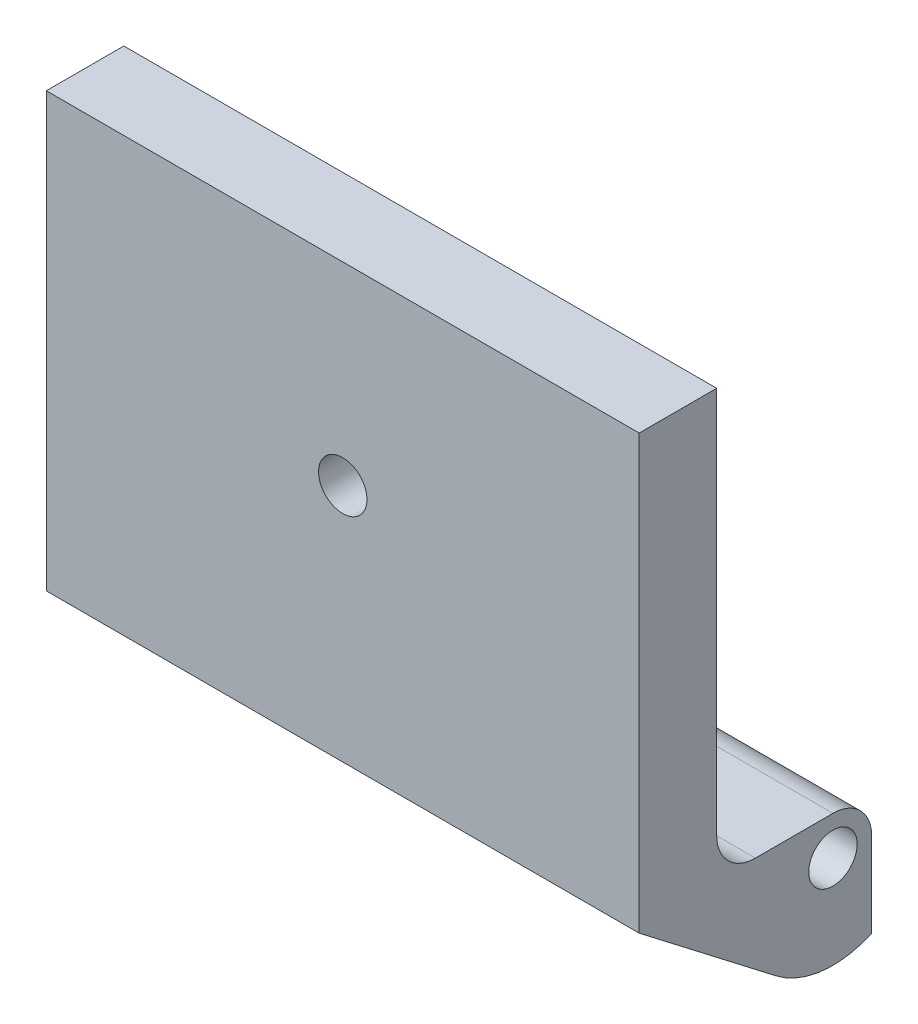
ISO-10303-21;
HEADER;
FILE_DESCRIPTION(('STEP AP214'),'2;1');
FILE_NAME('part.step','',(''),(''),'','','');
FILE_SCHEMA(('AUTOMOTIVE_DESIGN { 1 0 10303 214 1 1 1 1 }'));
ENDSEC;
DATA;
#1=APPLICATION_CONTEXT('core data for automotive mechanical design processes');
#2=APPLICATION_PROTOCOL_DEFINITION('international standard','automotive_design',2000,#1);
#3=PRODUCT_CONTEXT('',#1,'mechanical');
#4=PRODUCT('Part','Part','',(#3));
#5=PRODUCT_RELATED_PRODUCT_CATEGORY('part','',(#4));
#6=PRODUCT_DEFINITION_FORMATION('','',#4);
#7=PRODUCT_DEFINITION_CONTEXT('part definition',#1,'design');
#8=PRODUCT_DEFINITION('design','',#6,#7);
#9=PRODUCT_DEFINITION_SHAPE('','',#8);
#10=(LENGTH_UNIT() NAMED_UNIT(*) SI_UNIT(.MILLI.,.METRE.));
#11=(NAMED_UNIT(*) PLANE_ANGLE_UNIT() SI_UNIT($,.RADIAN.));
#12=(NAMED_UNIT(*) SI_UNIT($,.STERADIAN.) SOLID_ANGLE_UNIT());
#13=UNCERTAINTY_MEASURE_WITH_UNIT(LENGTH_MEASURE(1.E-05),#10,'distance_accuracy_value','');
#14=(GEOMETRIC_REPRESENTATION_CONTEXT(3) GLOBAL_UNCERTAINTY_ASSIGNED_CONTEXT((#13)) GLOBAL_UNIT_ASSIGNED_CONTEXT((#10,
#11,#12)) REPRESENTATION_CONTEXT('',''));
#15=CARTESIAN_POINT('',(0.,0.,0.));
#16=DIRECTION('',(0.,0.,1.));
#17=DIRECTION('',(1.,0.,0.));
#18=AXIS2_PLACEMENT_3D('',#15,#16,#17);
#19=CARTESIAN_POINT('',(-19.431,17.78,12.7));
#20=DIRECTION('',(1.,0.,0.));
#21=DIRECTION('',(0.,0.,-1.));
#22=AXIS2_PLACEMENT_3D('',#19,#20,#21);
#23=PLANE('',#22);
#24=CARTESIAN_POINT('',(-19.431,6.35,0.));
#25=DIRECTION('',(1.,0.,0.));
#26=DIRECTION('',(0.,0.,-1.));
#27=AXIS2_PLACEMENT_3D('',#24,#25,#26);
#28=CIRCLE('',#27,1.5875);
#29=CARTESIAN_POINT('',(-19.431,6.35,-1.5875));
#30=VERTEX_POINT('',#29);
#31=EDGE_CURVE('E160',#30,#30,#28,.T.);
#32=ORIENTED_EDGE('',*,*,#31,.T.);
#33=EDGE_LOOP('',(#32));
#34=FACE_BOUND('',#33,.T.);
#35=CARTESIAN_POINT('',(-19.431,6.35,0.));
#36=DIRECTION('',(-1.,0.,0.));
#37=DIRECTION('',(0.,0.,-1.));
#38=AXIS2_PLACEMENT_3D('',#35,#36,#37);
#39=CIRCLE('',#38,6.096);
#40=CARTESIAN_POINT('',(-19.431,0.808374245765057,-2.54));
#41=VERTEX_POINT('',#40);
#42=CARTESIAN_POINT('',(-19.431,1.5203526713738,3.71964012790133));
#43=VERTEX_POINT('',#42);
#44=EDGE_CURVE('E114',#41,#43,#39,.T.);
#45=ORIENTED_EDGE('',*,*,#44,.T.);
#46=DIRECTION('',(0.,0.61017718633552,0.792264981730019));
#47=VECTOR('',#46,1.);
#48=CARTESIAN_POINT('',(-19.431,8.43673903881376,12.7));
#49=LINE('',#48,#47);
#50=CARTESIAN_POINT('',(-19.431,8.43673903881376,12.7));
#51=VERTEX_POINT('',#50);
#52=EDGE_CURVE('E125',#43,#51,#49,.T.);
#53=ORIENTED_EDGE('',*,*,#52,.T.);
#54=DIRECTION('',(0.,-1.,0.));
#55=VECTOR('',#54,1.);
#56=CARTESIAN_POINT('',(-19.431,17.78,12.7));
#57=LINE('',#56,#55);
#58=CARTESIAN_POINT('',(-19.431,36.83,12.7));
#59=VERTEX_POINT('',#58);
#60=EDGE_CURVE('E11',#59,#51,#57,.T.);
#61=ORIENTED_EDGE('',*,*,#60,.F.);
#62=DIRECTION('',(0.,0.,-1.));
#63=VECTOR('',#62,1.);
#64=CARTESIAN_POINT('',(-19.431,36.83,59.1264476780208));
#65=LINE('',#64,#63);
#66=CARTESIAN_POINT('',(-19.431,36.83,7.62));
#67=VERTEX_POINT('',#66);
#68=EDGE_CURVE('E181',#59,#67,#65,.T.);
#69=ORIENTED_EDGE('',*,*,#68,.T.);
#70=DIRECTION('',(0.,-1.,0.));
#71=VECTOR('',#70,1.);
#72=CARTESIAN_POINT('',(-19.431,17.78,7.62));
#73=LINE('',#72,#71);
#74=CARTESIAN_POINT('',(-19.431,11.43,7.62));
#75=VERTEX_POINT('',#74);
#76=EDGE_CURVE('E154',#67,#75,#73,.T.);
#77=ORIENTED_EDGE('',*,*,#76,.T.);
#78=CARTESIAN_POINT('',(-19.431,11.43,5.08));
#79=DIRECTION('',(1.,0.,0.));
#80=DIRECTION('',(0.,0.,1.));
#81=AXIS2_PLACEMENT_3D('',#78,#79,#80);
#82=CIRCLE('',#81,2.54);
#83=CARTESIAN_POINT('',(-19.431,8.89,5.08));
#84=VERTEX_POINT('',#83);
#85=EDGE_CURVE('E193',#75,#84,#82,.T.);
#86=ORIENTED_EDGE('',*,*,#85,.T.);
#87=DIRECTION('',(0.,0.,-1.));
#88=VECTOR('',#87,1.);
#89=CARTESIAN_POINT('',(-19.431,8.89,5.08));
#90=LINE('',#89,#88);
#91=CARTESIAN_POINT('',(-19.431,8.89,0.));
#92=VERTEX_POINT('',#91);
#93=EDGE_CURVE('E138',#84,#92,#90,.T.);
#94=ORIENTED_EDGE('',*,*,#93,.T.);
#95=CARTESIAN_POINT('',(-19.431,6.35,0.));
#96=DIRECTION('',(-1.,0.,0.));
#97=DIRECTION('',(0.,0.,-1.));
#98=AXIS2_PLACEMENT_3D('',#95,#96,#97);
#99=CIRCLE('',#98,2.54);
#100=CARTESIAN_POINT('',(-19.431,6.34999999999998,-2.54));
#101=VERTEX_POINT('',#100);
#102=EDGE_CURVE('E134',#92,#101,#99,.T.);
#103=ORIENTED_EDGE('',*,*,#102,.T.);
#104=DIRECTION('',(0.,-1.,0.));
#105=VECTOR('',#104,1.);
#106=CARTESIAN_POINT('',(-19.431,6.34999999999998,-2.54));
#107=LINE('',#106,#105);
#108=EDGE_CURVE('E128',#101,#41,#107,.T.);
#109=ORIENTED_EDGE('',*,*,#108,.T.);
#110=EDGE_LOOP('',(#45,#53,#61,#69,#77,#86,#94,#103,#109));
#111=FACE_BOUND('',#110,.T.);
#112=ADVANCED_FACE('F38',(#34,#111),#23,.F.);
#113=CARTESIAN_POINT('',(19.431,17.78,12.7));
#114=DIRECTION('',(-1.,0.,0.));
#115=DIRECTION('',(0.,0.,1.));
#116=AXIS2_PLACEMENT_3D('',#113,#114,#115);
#117=PLANE('',#116);
#118=CARTESIAN_POINT('',(19.431,6.35,0.));
#119=DIRECTION('',(1.,0.,0.));
#120=DIRECTION('',(0.,0.,-1.));
#121=AXIS2_PLACEMENT_3D('',#118,#119,#120);
#122=CIRCLE('',#121,1.5875);
#123=CARTESIAN_POINT('',(19.431,6.35,-1.5875));
#124=VERTEX_POINT('',#123);
#125=EDGE_CURVE('E156',#124,#124,#122,.T.);
#126=ORIENTED_EDGE('',*,*,#125,.F.);
#127=EDGE_LOOP('',(#126));
#128=FACE_BOUND('',#127,.T.);
#129=DIRECTION('',(0.,-1.,0.));
#130=VECTOR('',#129,1.);
#131=CARTESIAN_POINT('',(19.431,17.78,12.7));
#132=LINE('',#131,#130);
#133=CARTESIAN_POINT('',(19.431,36.83,12.7));
#134=VERTEX_POINT('',#133);
#135=CARTESIAN_POINT('',(19.431,8.43673903881377,12.7));
#136=VERTEX_POINT('',#135);
#137=EDGE_CURVE('E45',#134,#136,#132,.T.);
#138=ORIENTED_EDGE('',*,*,#137,.T.);
#139=DIRECTION('',(0.,0.61017718633552,0.792264981730019));
#140=VECTOR('',#139,1.);
#141=CARTESIAN_POINT('',(19.431,8.43673903881376,12.7));
#142=LINE('',#141,#140);
#143=CARTESIAN_POINT('',(19.431,1.5203526713738,3.71964012790133));
#144=VERTEX_POINT('',#143);
#145=EDGE_CURVE('E52',#144,#136,#142,.T.);
#146=ORIENTED_EDGE('',*,*,#145,.F.);
#147=CARTESIAN_POINT('',(19.431,6.35,0.));
#148=DIRECTION('',(-1.,0.,0.));
#149=DIRECTION('',(0.,0.,-1.));
#150=AXIS2_PLACEMENT_3D('',#147,#148,#149);
#151=CIRCLE('',#150,6.096);
#152=CARTESIAN_POINT('',(19.431,0.808374245765057,-2.54));
#153=VERTEX_POINT('',#152);
#154=EDGE_CURVE('E244',#153,#144,#151,.T.);
#155=ORIENTED_EDGE('',*,*,#154,.F.);
#156=DIRECTION('',(0.,-1.,0.));
#157=VECTOR('',#156,1.);
#158=CARTESIAN_POINT('',(19.431,6.34999999999998,-2.54));
#159=LINE('',#158,#157);
#160=CARTESIAN_POINT('',(19.431,6.34999999999998,-2.54));
#161=VERTEX_POINT('',#160);
#162=EDGE_CURVE('E131',#161,#153,#159,.T.);
#163=ORIENTED_EDGE('',*,*,#162,.F.);
#164=CARTESIAN_POINT('',(19.431,6.35,0.));
#165=DIRECTION('',(-1.,0.,0.));
#166=DIRECTION('',(0.,0.,-1.));
#167=AXIS2_PLACEMENT_3D('',#164,#165,#166);
#168=CIRCLE('',#167,2.54);
#169=CARTESIAN_POINT('',(19.431,8.89,0.));
#170=VERTEX_POINT('',#169);
#171=EDGE_CURVE('E151',#170,#161,#168,.T.);
#172=ORIENTED_EDGE('',*,*,#171,.F.);
#173=DIRECTION('',(0.,0.,-1.));
#174=VECTOR('',#173,1.);
#175=CARTESIAN_POINT('',(19.431,8.89,5.08));
#176=LINE('',#175,#174);
#177=CARTESIAN_POINT('',(19.431,8.89,5.08));
#178=VERTEX_POINT('',#177);
#179=EDGE_CURVE('E148',#178,#170,#176,.T.);
#180=ORIENTED_EDGE('',*,*,#179,.F.);
#181=CARTESIAN_POINT('',(19.431,11.43,5.08));
#182=DIRECTION('',(1.,0.,0.));
#183=DIRECTION('',(0.,0.,1.));
#184=AXIS2_PLACEMENT_3D('',#181,#182,#183);
#185=CIRCLE('',#184,2.54);
#186=CARTESIAN_POINT('',(19.431,11.43,7.62));
#187=VERTEX_POINT('',#186);
#188=EDGE_CURVE('E144',#187,#178,#185,.T.);
#189=ORIENTED_EDGE('',*,*,#188,.F.);
#190=DIRECTION('',(0.,-1.,0.));
#191=VECTOR('',#190,1.);
#192=CARTESIAN_POINT('',(19.431,17.78,7.62));
#193=LINE('',#192,#191);
#194=CARTESIAN_POINT('',(19.431,36.83,7.62));
#195=VERTEX_POINT('',#194);
#196=EDGE_CURVE('E142',#195,#187,#193,.T.);
#197=ORIENTED_EDGE('',*,*,#196,.F.);
#198=DIRECTION('',(0.,0.,-1.));
#199=VECTOR('',#198,1.);
#200=CARTESIAN_POINT('',(19.431,36.83,59.1264476780208));
#201=LINE('',#200,#199);
#202=EDGE_CURVE('E169',#134,#195,#201,.T.);
#203=ORIENTED_EDGE('',*,*,#202,.F.);
#204=EDGE_LOOP('',(#138,#146,#155,#163,#172,#180,#189,#197,#203));
#205=FACE_BOUND('',#204,.T.);
#206=ADVANCED_FACE('F167',(#128,#205),#117,.F.);
#207=CARTESIAN_POINT('',(-19.431,6.34999999999998,-2.54));
#208=DIRECTION('',(0.,0.,1.));
#209=DIRECTION('',(0.,-1.,0.));
#210=AXIS2_PLACEMENT_3D('',#207,#208,#209);
#211=PLANE('',#210);
#212=ORIENTED_EDGE('',*,*,#162,.T.);
#213=DIRECTION('',(1.,0.,0.));
#214=VECTOR('',#213,1.);
#215=CARTESIAN_POINT('',(-19.431,0.808374245765057,-2.54));
#216=LINE('',#215,#214);
#217=EDGE_CURVE('E118',#41,#153,#216,.T.);
#218=ORIENTED_EDGE('',*,*,#217,.F.);
#219=ORIENTED_EDGE('',*,*,#108,.F.);
#220=DIRECTION('',(1.,0.,0.));
#221=VECTOR('',#220,1.);
#222=CARTESIAN_POINT('',(-19.431,6.34999999999998,-2.54));
#223=LINE('',#222,#221);
#224=EDGE_CURVE('E61',#101,#161,#223,.T.);
#225=ORIENTED_EDGE('',*,*,#224,.T.);
#226=EDGE_LOOP('',(#212,#218,#219,#225));
#227=FACE_BOUND('',#226,.T.);
#228=ADVANCED_FACE('F127',(#227),#211,.F.);
#229=CARTESIAN_POINT('',(19.431,17.78,12.7));
#230=DIRECTION('',(0.,0.,-1.));
#231=DIRECTION('',(-1.,0.,0.));
#232=AXIS2_PLACEMENT_3D('',#229,#230,#231);
#233=PLANE('',#232);
#234=CARTESIAN_POINT('',(0.,24.13,12.7));
#235=DIRECTION('',(0.,0.,-1.));
#236=DIRECTION('',(-1.,0.,0.));
#237=AXIS2_PLACEMENT_3D('',#234,#235,#236);
#238=CIRCLE('',#237,1.5875);
#239=CARTESIAN_POINT('',(0.,25.7175,12.7));
#240=VERTEX_POINT('',#239);
#241=EDGE_CURVE('E186',#240,#240,#238,.T.);
#242=ORIENTED_EDGE('',*,*,#241,.T.);
#243=EDGE_LOOP('',(#242));
#244=FACE_BOUND('',#243,.T.);
#245=ORIENTED_EDGE('',*,*,#60,.T.);
#246=DIRECTION('',(1.,0.,0.));
#247=VECTOR('',#246,1.);
#248=CARTESIAN_POINT('',(-19.431,8.43673903881376,12.7));
#249=LINE('',#248,#247);
#250=EDGE_CURVE('E175',#51,#136,#249,.T.);
#251=ORIENTED_EDGE('',*,*,#250,.T.);
#252=ORIENTED_EDGE('',*,*,#137,.F.);
#253=DIRECTION('',(-1.,0.,0.));
#254=VECTOR('',#253,1.);
#255=CARTESIAN_POINT('',(19.431,36.83,12.7));
#256=LINE('',#255,#254);
#257=EDGE_CURVE('E145',#134,#59,#256,.T.);
#258=ORIENTED_EDGE('',*,*,#257,.T.);
#259=EDGE_LOOP('',(#245,#251,#252,#258));
#260=FACE_BOUND('',#259,.T.);
#261=ADVANCED_FACE('F173',(#244,#260),#233,.F.);
#262=CARTESIAN_POINT('',(-19.431,6.35,0.));
#263=DIRECTION('',(1.,0.,0.));
#264=DIRECTION('',(0.,0.,-1.));
#265=AXIS2_PLACEMENT_3D('',#262,#263,#264);
#266=CYLINDRICAL_SURFACE('',#265,1.5875);
#267=CARTESIAN_POINT('',(-19.431,6.35,-1.5875));
#268=CARTESIAN_POINT('',(-19.0261875,6.35,-1.5875));
#269=CARTESIAN_POINT('',(-18.621375,6.35,-1.5875));
#270=CARTESIAN_POINT('',(-17.81175,6.35,-1.5875));
#271=CARTESIAN_POINT('',(-17.4069375,6.35,-1.5875));
#272=CARTESIAN_POINT('',(-16.5973125,6.35,-1.5875));
#273=CARTESIAN_POINT('',(-16.1925,6.35,-1.5875));
#274=CARTESIAN_POINT('',(-15.382875,6.35,-1.5875));
#275=CARTESIAN_POINT('',(-14.9780625,6.35,-1.5875));
#276=CARTESIAN_POINT('',(-14.1684375,6.35,-1.5875));
#277=CARTESIAN_POINT('',(-13.763625,6.35,-1.5875));
#278=CARTESIAN_POINT('',(-12.954,6.35,-1.5875));
#279=CARTESIAN_POINT('',(-12.5491875,6.35,-1.5875));
#280=CARTESIAN_POINT('',(-11.7395625,6.35,-1.5875));
#281=CARTESIAN_POINT('',(-11.33475,6.35,-1.5875));
#282=CARTESIAN_POINT('',(-10.525125,6.35,-1.5875));
#283=CARTESIAN_POINT('',(-10.1203125,6.35,-1.5875));
#284=CARTESIAN_POINT('',(-9.3106875,6.35,-1.5875));
#285=CARTESIAN_POINT('',(-8.905875,6.35,-1.5875));
#286=CARTESIAN_POINT('',(-8.09625,6.35,-1.5875));
#287=CARTESIAN_POINT('',(-7.6914375,6.35,-1.5875));
#288=CARTESIAN_POINT('',(-6.8818125,6.35,-1.5875));
#289=CARTESIAN_POINT('',(-6.477,6.35,-1.5875));
#290=CARTESIAN_POINT('',(-5.667375,6.35,-1.5875));
#291=CARTESIAN_POINT('',(-5.2625625,6.35,-1.5875));
#292=CARTESIAN_POINT('',(-4.4529375,6.35,-1.5875));
#293=CARTESIAN_POINT('',(-4.048125,6.35,-1.5875));
#294=CARTESIAN_POINT('',(-3.2385,6.35,-1.5875));
#295=CARTESIAN_POINT('',(-2.8336875,6.35,-1.5875));
#296=CARTESIAN_POINT('',(-2.0240625,6.35,-1.5875));
#297=CARTESIAN_POINT('',(-1.61925,6.35,-1.5875));
#298=CARTESIAN_POINT('',(-0.809624999999999,6.35,-1.5875));
#299=CARTESIAN_POINT('',(-0.404812499999999,6.35,-1.5875));
#300=CARTESIAN_POINT('',(0.404812499999999,6.35,-1.5875));
#301=CARTESIAN_POINT('',(0.809624999999999,6.35,-1.5875));
#302=CARTESIAN_POINT('',(1.61925,6.35,-1.5875));
#303=CARTESIAN_POINT('',(2.0240625,6.35,-1.5875));
#304=CARTESIAN_POINT('',(2.8336875,6.35,-1.5875));
#305=CARTESIAN_POINT('',(3.2385,6.35,-1.5875));
#306=CARTESIAN_POINT('',(4.048125,6.35,-1.5875));
#307=CARTESIAN_POINT('',(4.4529375,6.35,-1.5875));
#308=CARTESIAN_POINT('',(5.2625625,6.35,-1.5875));
#309=CARTESIAN_POINT('',(5.667375,6.35,-1.5875));
#310=CARTESIAN_POINT('',(6.477,6.35,-1.5875));
#311=CARTESIAN_POINT('',(6.8818125,6.35,-1.5875));
#312=CARTESIAN_POINT('',(7.6914375,6.35,-1.5875));
#313=CARTESIAN_POINT('',(8.09625,6.35,-1.5875));
#314=CARTESIAN_POINT('',(8.905875,6.35,-1.5875));
#315=CARTESIAN_POINT('',(9.3106875,6.35,-1.5875));
#316=CARTESIAN_POINT('',(10.1203125,6.35,-1.5875));
#317=CARTESIAN_POINT('',(10.525125,6.35,-1.5875));
#318=CARTESIAN_POINT('',(11.33475,6.35,-1.5875));
#319=CARTESIAN_POINT('',(11.7395625,6.35,-1.5875));
#320=CARTESIAN_POINT('',(12.5491875,6.35,-1.5875));
#321=CARTESIAN_POINT('',(12.954,6.35,-1.5875));
#322=CARTESIAN_POINT('',(13.763625,6.35,-1.5875));
#323=CARTESIAN_POINT('',(14.1684375,6.35,-1.5875));
#324=CARTESIAN_POINT('',(14.9780625,6.35,-1.5875));
#325=CARTESIAN_POINT('',(15.382875,6.35,-1.5875));
#326=CARTESIAN_POINT('',(16.1925,6.35,-1.5875));
#327=CARTESIAN_POINT('',(16.5973125,6.35,-1.5875));
#328=CARTESIAN_POINT('',(17.4069375,6.35,-1.5875));
#329=CARTESIAN_POINT('',(17.81175,6.35,-1.5875));
#330=CARTESIAN_POINT('',(18.621375,6.35,-1.5875));
#331=CARTESIAN_POINT('',(19.0261875,6.35,-1.5875));
#332=CARTESIAN_POINT('',(19.431,6.35,-1.5875));
#333=B_SPLINE_CURVE_WITH_KNOTS('',3,(#267,#268,#269,#270,#271,#272,#273,#274,#275,#276,#277,
#278,#279,#280,#281,#282,#283,#284,#285,#286,#287,#288,#289,#290,#291,#292,#293,#294,#295,#296,
#297,#298,#299,#300,#301,#302,#303,#304,#305,#306,#307,#308,#309,#310,#311,#312,#313,#314,#315,
#316,#317,#318,#319,#320,#321,#322,#323,#324,#325,#326,#327,#328,#329,#330,#331,#332),
.UNSPECIFIED.,.F.,.F.,(4,2,2,2,2,2,2,2,2,2,2,2,2,2,2,2,2,2,2,2,2,2,2,2,2,2,2,2,2,2,2,2,4),(0.,
1.2144375,2.428875,3.6433125,4.85775,6.0721875,7.286625,8.5010625,9.7155,10.9299375,12.144375,
13.3588125,14.57325,15.7876875,17.002125,18.2165625,19.431,20.6454375,21.859875,23.0743125,
24.28875,25.5031875,26.717625,27.9320625,29.1465,30.3609375,31.575375,32.7898125,34.00425,
35.2186875,36.433125,37.6475625,38.862),.UNSPECIFIED.);
#334=EDGE_CURVE('BSEAM202',#30,#124,#333,.T.);
#335=ORIENTED_EDGE('',*,*,#31,.F.);
#336=ORIENTED_EDGE('',*,*,#125,.T.);
#337=ORIENTED_EDGE('',*,*,#334,.T.);
#338=ORIENTED_EDGE('',*,*,#334,.F.);
#339=EDGE_LOOP('',(#335,#337,#336,#338));
#340=FACE_BOUND('',#339,.T.);
#341=ADVANCED_FACE('F202',(#340),#266,.F.);
#342=CARTESIAN_POINT('',(-19.431,6.35,0.));
#343=DIRECTION('',(1.,0.,0.));
#344=DIRECTION('',(0.,0.,-1.));
#345=AXIS2_PLACEMENT_3D('',#342,#343,#344);
#346=CYLINDRICAL_SURFACE('',#345,2.54);
#347=ORIENTED_EDGE('',*,*,#171,.T.);
#348=ORIENTED_EDGE('',*,*,#224,.F.);
#349=ORIENTED_EDGE('',*,*,#102,.F.);
#350=DIRECTION('',(1.,0.,0.));
#351=VECTOR('',#350,1.);
#352=CARTESIAN_POINT('',(-19.431,8.89,0.));
#353=LINE('',#352,#351);
#354=EDGE_CURVE('E157',#92,#170,#353,.T.);
#355=ORIENTED_EDGE('',*,*,#354,.T.);
#356=EDGE_LOOP('',(#347,#348,#349,#355));
#357=FACE_BOUND('',#356,.T.);
#358=ADVANCED_FACE('F200',(#357),#346,.T.);
#359=CARTESIAN_POINT('',(-19.431,8.89,5.08));
#360=DIRECTION('',(0.,-1.,0.));
#361=DIRECTION('',(0.,0.,-1.));
#362=AXIS2_PLACEMENT_3D('',#359,#360,#361);
#363=PLANE('',#362);
#364=ORIENTED_EDGE('',*,*,#179,.T.);
#365=ORIENTED_EDGE('',*,*,#354,.F.);
#366=ORIENTED_EDGE('',*,*,#93,.F.);
#367=DIRECTION('',(1.,0.,0.));
#368=VECTOR('',#367,1.);
#369=CARTESIAN_POINT('',(-19.431,8.89,5.08));
#370=LINE('',#369,#368);
#371=EDGE_CURVE('E136',#84,#178,#370,.T.);
#372=ORIENTED_EDGE('',*,*,#371,.T.);
#373=EDGE_LOOP('',(#364,#365,#366,#372));
#374=FACE_BOUND('',#373,.T.);
#375=ADVANCED_FACE('F197',(#374),#363,.F.);
#376=CARTESIAN_POINT('',(-19.431,11.43,5.08));
#377=DIRECTION('',(1.,0.,0.));
#378=DIRECTION('',(0.,0.,-1.));
#379=AXIS2_PLACEMENT_3D('',#376,#377,#378);
#380=CYLINDRICAL_SURFACE('',#379,2.54);
#381=ORIENTED_EDGE('',*,*,#188,.T.);
#382=ORIENTED_EDGE('',*,*,#371,.F.);
#383=ORIENTED_EDGE('',*,*,#85,.F.);
#384=DIRECTION('',(1.,0.,0.));
#385=VECTOR('',#384,1.);
#386=CARTESIAN_POINT('',(-19.431,11.43,7.62));
#387=LINE('',#386,#385);
#388=EDGE_CURVE('E86',#75,#187,#387,.T.);
#389=ORIENTED_EDGE('',*,*,#388,.T.);
#390=EDGE_LOOP('',(#381,#382,#383,#389));
#391=FACE_BOUND('',#390,.T.);
#392=ADVANCED_FACE('F208',(#391),#380,.F.);
#393=CARTESIAN_POINT('',(-19.431,17.78,7.62));
#394=DIRECTION('',(0.,0.,1.));
#395=DIRECTION('',(0.,-1.,0.));
#396=AXIS2_PLACEMENT_3D('',#393,#394,#395);
#397=PLANE('',#396);
#398=CARTESIAN_POINT('',(0.,24.13,7.62));
#399=DIRECTION('',(0.,0.,-1.));
#400=DIRECTION('',(0.,1.,0.));
#401=AXIS2_PLACEMENT_3D('',#398,#399,#400);
#402=CIRCLE('',#401,1.5875);
#403=CARTESIAN_POINT('',(0.,25.7175,7.62));
#404=VERTEX_POINT('',#403);
#405=EDGE_CURVE('E236',#404,#404,#402,.T.);
#406=ORIENTED_EDGE('',*,*,#405,.F.);
#407=EDGE_LOOP('',(#406));
#408=FACE_BOUND('',#407,.T.);
#409=ORIENTED_EDGE('',*,*,#196,.T.);
#410=ORIENTED_EDGE('',*,*,#388,.F.);
#411=ORIENTED_EDGE('',*,*,#76,.F.);
#412=DIRECTION('',(1.,0.,0.));
#413=VECTOR('',#412,1.);
#414=CARTESIAN_POINT('',(19.431,36.83,7.62));
#415=LINE('',#414,#413);
#416=EDGE_CURVE('E188',#67,#195,#415,.T.);
#417=ORIENTED_EDGE('',*,*,#416,.T.);
#418=EDGE_LOOP('',(#409,#410,#411,#417));
#419=FACE_BOUND('',#418,.T.);
#420=ADVANCED_FACE('F249',(#408,#419),#397,.F.);
#421=CARTESIAN_POINT('',(19.431,36.83,59.1264476780208));
#422=DIRECTION('',(0.,1.,0.));
#423=DIRECTION('',(0.,0.,1.));
#424=AXIS2_PLACEMENT_3D('',#421,#422,#423);
#425=PLANE('',#424);
#426=ORIENTED_EDGE('',*,*,#257,.F.);
#427=ORIENTED_EDGE('',*,*,#202,.T.);
#428=ORIENTED_EDGE('',*,*,#416,.F.);
#429=ORIENTED_EDGE('',*,*,#68,.F.);
#430=EDGE_LOOP('',(#426,#427,#428,#429));
#431=FACE_BOUND('',#430,.T.);
#432=ADVANCED_FACE('F177',(#431),#425,.T.);
#433=CARTESIAN_POINT('',(0.,24.13,33.02));
#434=DIRECTION('',(0.,0.,-1.));
#435=DIRECTION('',(0.,1.,0.));
#436=AXIS2_PLACEMENT_3D('',#433,#434,#435);
#437=CYLINDRICAL_SURFACE('',#436,1.5875);
#438=CARTESIAN_POINT('',(0.,25.7175,7.62));
#439=CARTESIAN_POINT('',(0.,25.7175,7.67291666666666));
#440=CARTESIAN_POINT('',(0.,25.7175,7.72583333333333));
#441=CARTESIAN_POINT('',(0.,25.7175,7.83166666666666));
#442=CARTESIAN_POINT('',(0.,25.7175,7.88458333333333));
#443=CARTESIAN_POINT('',(0.,25.7175,7.99041666666666));
#444=CARTESIAN_POINT('',(0.,25.7175,8.04333333333333));
#445=CARTESIAN_POINT('',(0.,25.7175,8.14916666666667));
#446=CARTESIAN_POINT('',(0.,25.7175,8.20208333333333));
#447=CARTESIAN_POINT('',(0.,25.7175,8.30791666666667));
#448=CARTESIAN_POINT('',(0.,25.7175,8.36083333333333));
#449=CARTESIAN_POINT('',(0.,25.7175,8.46666666666667));
#450=CARTESIAN_POINT('',(0.,25.7175,8.51958333333333));
#451=CARTESIAN_POINT('',(0.,25.7175,8.62541666666667));
#452=CARTESIAN_POINT('',(0.,25.7175,8.67833333333333));
#453=CARTESIAN_POINT('',(0.,25.7175,8.78416666666667));
#454=CARTESIAN_POINT('',(0.,25.7175,8.83708333333333));
#455=CARTESIAN_POINT('',(0.,25.7175,8.94291666666667));
#456=CARTESIAN_POINT('',(0.,25.7175,8.99583333333333));
#457=CARTESIAN_POINT('',(0.,25.7175,9.10166666666666));
#458=CARTESIAN_POINT('',(0.,25.7175,9.15458333333333));
#459=CARTESIAN_POINT('',(0.,25.7175,9.26041666666666));
#460=CARTESIAN_POINT('',(0.,25.7175,9.31333333333333));
#461=CARTESIAN_POINT('',(0.,25.7175,9.41916666666667));
#462=CARTESIAN_POINT('',(0.,25.7175,9.47208333333333));
#463=CARTESIAN_POINT('',(0.,25.7175,9.57791666666667));
#464=CARTESIAN_POINT('',(0.,25.7175,9.63083333333333));
#465=CARTESIAN_POINT('',(0.,25.7175,9.73666666666667));
#466=CARTESIAN_POINT('',(0.,25.7175,9.78958333333333));
#467=CARTESIAN_POINT('',(0.,25.7175,9.89541666666667));
#468=CARTESIAN_POINT('',(0.,25.7175,9.94833333333333));
#469=CARTESIAN_POINT('',(0.,25.7175,10.0541666666667));
#470=CARTESIAN_POINT('',(0.,25.7175,10.1070833333333));
#471=CARTESIAN_POINT('',(0.,25.7175,10.2129166666667));
#472=CARTESIAN_POINT('',(0.,25.7175,10.2658333333333));
#473=CARTESIAN_POINT('',(0.,25.7175,10.3716666666667));
#474=CARTESIAN_POINT('',(0.,25.7175,10.4245833333333));
#475=CARTESIAN_POINT('',(0.,25.7175,10.5304166666667));
#476=CARTESIAN_POINT('',(0.,25.7175,10.5833333333333));
#477=CARTESIAN_POINT('',(0.,25.7175,10.6891666666667));
#478=CARTESIAN_POINT('',(0.,25.7175,10.7420833333333));
#479=CARTESIAN_POINT('',(0.,25.7175,10.8479166666667));
#480=CARTESIAN_POINT('',(0.,25.7175,10.9008333333333));
#481=CARTESIAN_POINT('',(0.,25.7175,11.0066666666667));
#482=CARTESIAN_POINT('',(0.,25.7175,11.0595833333333));
#483=CARTESIAN_POINT('',(0.,25.7175,11.1654166666667));
#484=CARTESIAN_POINT('',(0.,25.7175,11.2183333333333));
#485=CARTESIAN_POINT('',(0.,25.7175,11.3241666666667));
#486=CARTESIAN_POINT('',(0.,25.7175,11.3770833333333));
#487=CARTESIAN_POINT('',(0.,25.7175,11.4829166666667));
#488=CARTESIAN_POINT('',(0.,25.7175,11.5358333333333));
#489=CARTESIAN_POINT('',(0.,25.7175,11.6416666666667));
#490=CARTESIAN_POINT('',(0.,25.7175,11.6945833333333));
#491=CARTESIAN_POINT('',(0.,25.7175,11.8004166666667));
#492=CARTESIAN_POINT('',(0.,25.7175,11.8533333333333));
#493=CARTESIAN_POINT('',(0.,25.7175,11.9591666666667));
#494=CARTESIAN_POINT('',(0.,25.7175,12.0120833333333));
#495=CARTESIAN_POINT('',(0.,25.7175,12.1179166666667));
#496=CARTESIAN_POINT('',(0.,25.7175,12.1708333333333));
#497=CARTESIAN_POINT('',(0.,25.7175,12.2766666666667));
#498=CARTESIAN_POINT('',(0.,25.7175,12.3295833333333));
#499=CARTESIAN_POINT('',(0.,25.7175,12.4354166666667));
#500=CARTESIAN_POINT('',(0.,25.7175,12.4883333333333));
#501=CARTESIAN_POINT('',(0.,25.7175,12.5941666666667));
#502=CARTESIAN_POINT('',(0.,25.7175,12.6470833333333));
#503=CARTESIAN_POINT('',(0.,25.7175,12.7));
#504=B_SPLINE_CURVE_WITH_KNOTS('',3,(#438,#439,#440,#441,#442,#443,#444,#445,#446,#447,#448,
#449,#450,#451,#452,#453,#454,#455,#456,#457,#458,#459,#460,#461,#462,#463,#464,#465,#466,#467,
#468,#469,#470,#471,#472,#473,#474,#475,#476,#477,#478,#479,#480,#481,#482,#483,#484,#485,#486,
#487,#488,#489,#490,#491,#492,#493,#494,#495,#496,#497,#498,#499,#500,#501,#502,#503),
.UNSPECIFIED.,.F.,.F.,(4,2,2,2,2,2,2,2,2,2,2,2,2,2,2,2,2,2,2,2,2,2,2,2,2,2,2,2,2,2,2,2,4),(0.,
0.158749999999999,0.317499999999998,0.476250000000001,0.635,0.793749999999999,0.952500000000002,
1.11125,1.27,1.42875,1.5875,1.74625,1.905,2.06375,2.2225,2.38125,2.54,2.69875,2.8575,3.01625,
3.175,3.33375,3.4925,3.65125,3.81,3.96875,4.1275,4.28625,4.445,4.60375,4.7625,4.92125,5.08),.UNSPECIFIED.);
#505=EDGE_CURVE('BSEAM256',#404,#240,#504,.T.);
#506=ORIENTED_EDGE('',*,*,#405,.T.);
#507=ORIENTED_EDGE('',*,*,#241,.F.);
#508=ORIENTED_EDGE('',*,*,#505,.T.);
#509=ORIENTED_EDGE('',*,*,#505,.F.);
#510=EDGE_LOOP('',(#506,#508,#507,#509));
#511=FACE_BOUND('',#510,.T.);
#512=ADVANCED_FACE('F256',(#511),#437,.F.);
#513=CARTESIAN_POINT('',(-19.431,8.43673903881376,12.7));
#514=DIRECTION('',(0.,0.792264981730019,-0.61017718633552));
#515=DIRECTION('',(0.,0.61017718633552,0.792264981730019));
#516=AXIS2_PLACEMENT_3D('',#513,#514,#515);
#517=PLANE('',#516);
#518=ORIENTED_EDGE('',*,*,#145,.T.);
#519=ORIENTED_EDGE('',*,*,#250,.F.);
#520=ORIENTED_EDGE('',*,*,#52,.F.);
#521=DIRECTION('',(1.,0.,0.));
#522=VECTOR('',#521,1.);
#523=CARTESIAN_POINT('',(-19.431,1.5203526713738,3.71964012790133));
#524=LINE('',#523,#522);
#525=EDGE_CURVE('E120',#43,#144,#524,.T.);
#526=ORIENTED_EDGE('',*,*,#525,.T.);
#527=EDGE_LOOP('',(#518,#519,#520,#526));
#528=FACE_BOUND('',#527,.T.);
#529=ADVANCED_FACE('F246',(#528),#517,.F.);
#530=CARTESIAN_POINT('',(-19.431,6.35,0.));
#531=DIRECTION('',(1.,0.,0.));
#532=DIRECTION('',(0.,0.,-1.));
#533=AXIS2_PLACEMENT_3D('',#530,#531,#532);
#534=CYLINDRICAL_SURFACE('',#533,6.096);
#535=ORIENTED_EDGE('',*,*,#154,.T.);
#536=ORIENTED_EDGE('',*,*,#525,.F.);
#537=ORIENTED_EDGE('',*,*,#44,.F.);
#538=ORIENTED_EDGE('',*,*,#217,.T.);
#539=EDGE_LOOP('',(#535,#536,#537,#538));
#540=FACE_BOUND('',#539,.T.);
#541=ADVANCED_FACE('F117',(#540),#534,.T.);
#542=CLOSED_SHELL('',(#112,#206,#228,#261,#341,#358,#375,#392,#420,#432,#512,#529,#541));
#543=MANIFOLD_SOLID_BREP('B2',#542);
#544=ADVANCED_BREP_SHAPE_REPRESENTATION('',(#18,#543),#14);
#545=SHAPE_DEFINITION_REPRESENTATION(#9,#544);
ENDSEC;
END-ISO-10303-21;
